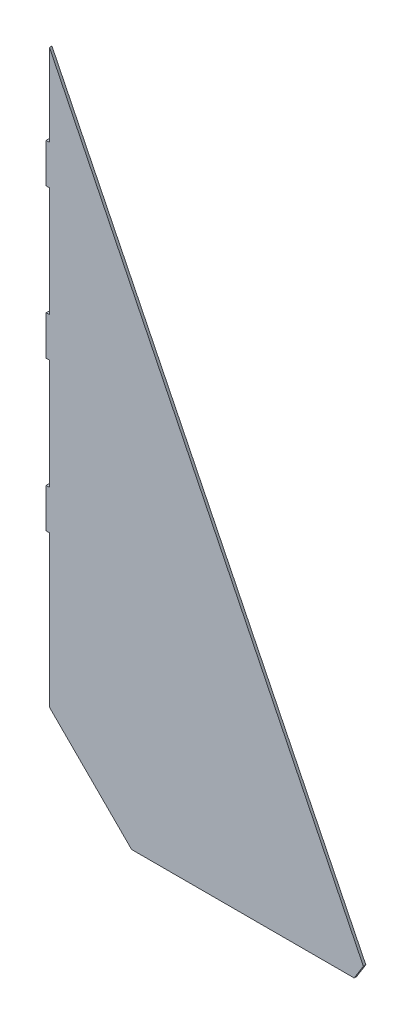
ISO-10303-21;
HEADER;
FILE_DESCRIPTION(('STEP AP214'),'2;1');
FILE_NAME('part.step','',(''),(''),'','','');
FILE_SCHEMA(('AUTOMOTIVE_DESIGN { 1 0 10303 214 1 1 1 1 }'));
ENDSEC;
DATA;
#1=APPLICATION_CONTEXT('core data for automotive mechanical design processes');
#2=APPLICATION_PROTOCOL_DEFINITION('international standard','automotive_design',2000,#1);
#3=PRODUCT_CONTEXT('',#1,'mechanical');
#4=PRODUCT('Part','Part','',(#3));
#5=PRODUCT_RELATED_PRODUCT_CATEGORY('part','',(#4));
#6=PRODUCT_DEFINITION_FORMATION('','',#4);
#7=PRODUCT_DEFINITION_CONTEXT('part definition',#1,'design');
#8=PRODUCT_DEFINITION('design','',#6,#7);
#9=PRODUCT_DEFINITION_SHAPE('','',#8);
#10=(LENGTH_UNIT() NAMED_UNIT(*) SI_UNIT(.MILLI.,.METRE.));
#11=(NAMED_UNIT(*) PLANE_ANGLE_UNIT() SI_UNIT($,.RADIAN.));
#12=(NAMED_UNIT(*) SI_UNIT($,.STERADIAN.) SOLID_ANGLE_UNIT());
#13=UNCERTAINTY_MEASURE_WITH_UNIT(LENGTH_MEASURE(1.E-05),#10,'distance_accuracy_value','');
#14=(GEOMETRIC_REPRESENTATION_CONTEXT(3) GLOBAL_UNCERTAINTY_ASSIGNED_CONTEXT((#13)) GLOBAL_UNIT_ASSIGNED_CONTEXT((#10,
#11,#12)) REPRESENTATION_CONTEXT('',''));
#15=CARTESIAN_POINT('',(0.,0.,0.));
#16=DIRECTION('',(0.,0.,1.));
#17=DIRECTION('',(1.,0.,0.));
#18=AXIS2_PLACEMENT_3D('',#15,#16,#17);
#19=CARTESIAN_POINT('',(0.,0.,1.5));
#20=DIRECTION('',(1.,0.,0.));
#21=DIRECTION('',(0.,0.,-1.));
#22=AXIS2_PLACEMENT_3D('',#19,#20,#21);
#23=PLANE('',#22);
#24=DIRECTION('',(0.,0.,1.));
#25=VECTOR('',#24,1.);
#26=CARTESIAN_POINT('',(0.,41.9833520752449,0.));
#27=LINE('',#26,#25);
#28=CARTESIAN_POINT('',(0.,41.9833520752449,0.));
#29=VERTEX_POINT('',#28);
#30=CARTESIAN_POINT('',(0.,41.9833520752449,1.5));
#31=VERTEX_POINT('',#30);
#32=EDGE_CURVE('E303',#29,#31,#27,.T.);
#33=ORIENTED_EDGE('',*,*,#32,.F.);
#34=DIRECTION('',(0.,-1.,0.));
#35=VECTOR('',#34,1.);
#36=CARTESIAN_POINT('',(0.,0.,0.));
#37=LINE('',#36,#35);
#38=CARTESIAN_POINT('',(0.,-50.,0.));
#39=VERTEX_POINT('',#38);
#40=EDGE_CURVE('E179',#29,#39,#37,.T.);
#41=ORIENTED_EDGE('',*,*,#40,.T.);
#42=DIRECTION('',(0.,0.,-1.));
#43=VECTOR('',#42,1.);
#44=CARTESIAN_POINT('',(0.,-50.,1.5));
#45=LINE('',#44,#43);
#46=CARTESIAN_POINT('',(0.,-50.,1.5));
#47=VERTEX_POINT('',#46);
#48=EDGE_CURVE('E11',#47,#39,#45,.T.);
#49=ORIENTED_EDGE('',*,*,#48,.F.);
#50=DIRECTION('',(0.,-1.,0.));
#51=VECTOR('',#50,1.);
#52=CARTESIAN_POINT('',(0.,-50.,1.5));
#53=LINE('',#52,#51);
#54=EDGE_CURVE('E39',#31,#47,#53,.T.);
#55=ORIENTED_EDGE('',*,*,#54,.F.);
#56=EDGE_LOOP('',(#33,#41,#49,#55));
#57=FACE_BOUND('',#56,.T.);
#58=ADVANCED_FACE('F35',(#57),#23,.F.);
#59=DIRECTION('',(0.,0.,-1.));
#60=VECTOR('',#59,1.);
#61=CARTESIAN_POINT('',(0.,65.9833520752449,0.));
#62=LINE('',#61,#60);
#63=CARTESIAN_POINT('',(0.,65.9833520752449,1.5));
#64=VERTEX_POINT('',#63);
#65=CARTESIAN_POINT('',(0.,65.9833520752449,0.));
#66=VERTEX_POINT('',#65);
#67=EDGE_CURVE('E60',#64,#66,#62,.T.);
#68=ORIENTED_EDGE('',*,*,#67,.F.);
#69=CARTESIAN_POINT('',(0.,132.983352075244,1.5));
#70=VERTEX_POINT('',#69);
#71=EDGE_CURVE('E259',#70,#64,#53,.T.);
#72=ORIENTED_EDGE('',*,*,#71,.F.);
#73=DIRECTION('',(0.,0.,1.));
#74=VECTOR('',#73,1.);
#75=CARTESIAN_POINT('',(0.,132.983352075244,0.));
#76=LINE('',#75,#74);
#77=CARTESIAN_POINT('',(0.,132.983352075244,0.));
#78=VERTEX_POINT('',#77);
#79=EDGE_CURVE('E180',#78,#70,#76,.T.);
#80=ORIENTED_EDGE('',*,*,#79,.F.);
#81=EDGE_CURVE('E255',#78,#66,#37,.T.);
#82=ORIENTED_EDGE('',*,*,#81,.T.);
#83=EDGE_LOOP('',(#68,#72,#80,#82));
#84=FACE_BOUND('',#83,.T.);
#85=ADVANCED_FACE('F333',(#84),#23,.F.);
#86=DIRECTION('',(0.,0.,-1.));
#87=VECTOR('',#86,1.);
#88=CARTESIAN_POINT('',(0.,156.983352075244,0.));
#89=LINE('',#88,#87);
#90=CARTESIAN_POINT('',(0.,156.983352075244,1.5));
#91=VERTEX_POINT('',#90);
#92=CARTESIAN_POINT('',(0.,156.983352075244,0.));
#93=VERTEX_POINT('',#92);
#94=EDGE_CURVE('E183',#91,#93,#89,.T.);
#95=ORIENTED_EDGE('',*,*,#94,.F.);
#96=CARTESIAN_POINT('',(0.,223.863160558031,1.5));
#97=VERTEX_POINT('',#96);
#98=EDGE_CURVE('E231',#97,#91,#53,.T.);
#99=ORIENTED_EDGE('',*,*,#98,.F.);
#100=DIRECTION('',(0.,0.,1.));
#101=VECTOR('',#100,1.);
#102=CARTESIAN_POINT('',(0.,223.863160558031,1.5));
#103=LINE('',#102,#101);
#104=CARTESIAN_POINT('',(0.,223.863160558031,0.));
#105=VERTEX_POINT('',#104);
#106=EDGE_CURVE('E212',#105,#97,#103,.T.);
#107=ORIENTED_EDGE('',*,*,#106,.F.);
#108=EDGE_CURVE('E258',#105,#93,#37,.T.);
#109=ORIENTED_EDGE('',*,*,#108,.T.);
#110=EDGE_LOOP('',(#95,#99,#107,#109));
#111=FACE_BOUND('',#110,.T.);
#112=ADVANCED_FACE('F347',(#111),#23,.F.);
#113=DIRECTION('',(0.,0.,-1.));
#114=VECTOR('',#113,1.);
#115=CARTESIAN_POINT('',(0.,247.863160558031,0.));
#116=LINE('',#115,#114);
#117=CARTESIAN_POINT('',(0.,247.863160558031,1.5));
#118=VERTEX_POINT('',#117);
#119=CARTESIAN_POINT('',(0.,247.863160558031,0.));
#120=VERTEX_POINT('',#119);
#121=EDGE_CURVE('E217',#118,#120,#116,.T.);
#122=ORIENTED_EDGE('',*,*,#121,.F.);
#123=CARTESIAN_POINT('',(0.,297.863160558031,1.5));
#124=VERTEX_POINT('',#123);
#125=EDGE_CURVE('E310',#124,#118,#53,.T.);
#126=ORIENTED_EDGE('',*,*,#125,.F.);
#127=DIRECTION('',(0.,0.,-1.));
#128=VECTOR('',#127,1.);
#129=CARTESIAN_POINT('',(0.,297.863160558031,1.5));
#130=LINE('',#129,#128);
#131=CARTESIAN_POINT('',(0.,297.863160558031,0.));
#132=VERTEX_POINT('',#131);
#133=EDGE_CURVE('E265',#124,#132,#130,.T.);
#134=ORIENTED_EDGE('',*,*,#133,.T.);
#135=EDGE_CURVE('E272',#132,#120,#37,.T.);
#136=ORIENTED_EDGE('',*,*,#135,.T.);
#137=EDGE_LOOP('',(#122,#126,#134,#136));
#138=FACE_BOUND('',#137,.T.);
#139=ADVANCED_FACE('F359',(#138),#23,.F.);
#140=CARTESIAN_POINT('',(50.,-100.,1.5));
#141=DIRECTION('',(0.707106781186547,0.707106781186548,0.));
#142=DIRECTION('',(-0.707106781186548,0.707106781186547,0.));
#143=AXIS2_PLACEMENT_3D('',#140,#141,#142);
#144=PLANE('',#143);
#145=DIRECTION('',(0.707106781186548,-0.707106781186547,0.));
#146=VECTOR('',#145,1.);
#147=CARTESIAN_POINT('',(50.,-100.,0.));
#148=LINE('',#147,#146);
#149=CARTESIAN_POINT('',(50.,-100.,0.));
#150=VERTEX_POINT('',#149);
#151=EDGE_CURVE('E242',#39,#150,#148,.T.);
#152=ORIENTED_EDGE('',*,*,#151,.T.);
#153=DIRECTION('',(0.,0.,-1.));
#154=VECTOR('',#153,1.);
#155=CARTESIAN_POINT('',(50.,-100.,1.5));
#156=LINE('',#155,#154);
#157=CARTESIAN_POINT('',(50.,-100.,1.5));
#158=VERTEX_POINT('',#157);
#159=EDGE_CURVE('E45',#158,#150,#156,.T.);
#160=ORIENTED_EDGE('',*,*,#159,.F.);
#161=DIRECTION('',(0.707106781186548,-0.707106781186547,0.));
#162=VECTOR('',#161,1.);
#163=CARTESIAN_POINT('',(50.,-100.,1.5));
#164=LINE('',#163,#162);
#165=EDGE_CURVE('E308',#47,#158,#164,.T.);
#166=ORIENTED_EDGE('',*,*,#165,.F.);
#167=ORIENTED_EDGE('',*,*,#48,.T.);
#168=EDGE_LOOP('',(#152,#160,#166,#167));
#169=FACE_BOUND('',#168,.T.);
#170=ADVANCED_FACE('F37',(#169),#144,.F.);
#171=CARTESIAN_POINT('',(185.503893900373,-99.9999999999999,1.5));
#172=DIRECTION('',(0.,1.,0.));
#173=DIRECTION('',(-1.,0.,0.));
#174=AXIS2_PLACEMENT_3D('',#171,#172,#173);
#175=PLANE('',#174);
#176=DIRECTION('',(1.,0.,0.));
#177=VECTOR('',#176,1.);
#178=CARTESIAN_POINT('',(185.503893900373,-99.9999999999999,0.));
#179=LINE('',#178,#177);
#180=CARTESIAN_POINT('',(185.503893900373,-99.9999999999999,0.));
#181=VERTEX_POINT('',#180);
#182=EDGE_CURVE('E299',#150,#181,#179,.T.);
#183=ORIENTED_EDGE('',*,*,#182,.T.);
#184=DIRECTION('',(0.,0.,-1.));
#185=VECTOR('',#184,1.);
#186=CARTESIAN_POINT('',(185.503893900373,-99.9999999999999,1.5));
#187=LINE('',#186,#185);
#188=CARTESIAN_POINT('',(185.503893900373,-99.9999999999999,1.5));
#189=VERTEX_POINT('',#188);
#190=EDGE_CURVE('E276',#189,#181,#187,.T.);
#191=ORIENTED_EDGE('',*,*,#190,.F.);
#192=DIRECTION('',(1.,0.,0.));
#193=VECTOR('',#192,1.);
#194=CARTESIAN_POINT('',(185.503893900373,-99.9999999999999,1.5));
#195=LINE('',#194,#193);
#196=EDGE_CURVE('E294',#158,#189,#195,.T.);
#197=ORIENTED_EDGE('',*,*,#196,.F.);
#198=ORIENTED_EDGE('',*,*,#159,.T.);
#199=EDGE_LOOP('',(#183,#191,#197,#198));
#200=FACE_BOUND('',#199,.T.);
#201=ADVANCED_FACE('F366',(#200),#175,.F.);
#202=CARTESIAN_POINT('',(191.09372222287,-91.0250133273105,1.5));
#203=DIRECTION('',(-0.848827770442937,0.528669477201846,0.));
#204=DIRECTION('',(-0.528669477201846,-0.848827770442937,0.));
#205=AXIS2_PLACEMENT_3D('',#202,#203,#204);
#206=PLANE('',#205);
#207=DIRECTION('',(0.528669477201846,0.848827770442937,0.));
#208=VECTOR('',#207,1.);
#209=CARTESIAN_POINT('',(191.09372222287,-91.0250133273105,0.));
#210=LINE('',#209,#208);
#211=CARTESIAN_POINT('',(191.09372222287,-91.0250133273105,0.));
#212=VERTEX_POINT('',#211);
#213=EDGE_CURVE('E300',#181,#212,#210,.T.);
#214=ORIENTED_EDGE('',*,*,#213,.T.);
#215=DIRECTION('',(0.,0.,-1.));
#216=VECTOR('',#215,1.);
#217=CARTESIAN_POINT('',(191.09372222287,-91.0250133273105,1.5));
#218=LINE('',#217,#216);
#219=CARTESIAN_POINT('',(191.09372222287,-91.0250133273105,1.5));
#220=VERTEX_POINT('',#219);
#221=EDGE_CURVE('E278',#220,#212,#218,.T.);
#222=ORIENTED_EDGE('',*,*,#221,.F.);
#223=DIRECTION('',(0.528669477201846,0.848827770442937,0.));
#224=VECTOR('',#223,1.);
#225=CARTESIAN_POINT('',(191.09372222287,-91.0250133273105,1.5));
#226=LINE('',#225,#224);
#227=EDGE_CURVE('E290',#189,#220,#226,.T.);
#228=ORIENTED_EDGE('',*,*,#227,.F.);
#229=ORIENTED_EDGE('',*,*,#190,.T.);
#230=EDGE_LOOP('',(#214,#222,#228,#229));
#231=FACE_BOUND('',#230,.T.);
#232=ADVANCED_FACE('F503',(#231),#206,.F.);
#233=CARTESIAN_POINT('',(0.,297.863160558031,1.5));
#234=DIRECTION('',(-0.897498667268944,-0.44101716775027,0.));
#235=DIRECTION('',(0.44101716775027,-0.897498667268944,0.));
#236=AXIS2_PLACEMENT_3D('',#233,#234,#235);
#237=PLANE('',#236);
#238=DIRECTION('',(-0.44101716775027,0.897498667268944,0.));
#239=VECTOR('',#238,1.);
#240=CARTESIAN_POINT('',(0.,297.863160558031,0.));
#241=LINE('',#240,#239);
#242=EDGE_CURVE('E263',#212,#132,#241,.T.);
#243=ORIENTED_EDGE('',*,*,#242,.T.);
#244=ORIENTED_EDGE('',*,*,#133,.F.);
#245=DIRECTION('',(-0.44101716775027,0.897498667268944,0.));
#246=VECTOR('',#245,1.);
#247=CARTESIAN_POINT('',(0.,297.863160558031,1.5));
#248=LINE('',#247,#246);
#249=EDGE_CURVE('E285',#220,#124,#248,.T.);
#250=ORIENTED_EDGE('',*,*,#249,.F.);
#251=ORIENTED_EDGE('',*,*,#221,.T.);
#252=EDGE_LOOP('',(#243,#244,#250,#251));
#253=FACE_BOUND('',#252,.T.);
#254=ADVANCED_FACE('F395',(#253),#237,.F.);
#255=CARTESIAN_POINT('',(0.,0.,1.5));
#256=DIRECTION('',(0.,0.,1.));
#257=DIRECTION('',(1.,0.,0.));
#258=AXIS2_PLACEMENT_3D('',#255,#256,#257);
#259=PLANE('',#258);
#260=ORIENTED_EDGE('',*,*,#125,.T.);
#261=DIRECTION('',(1.,0.,0.));
#262=VECTOR('',#261,1.);
#263=CARTESIAN_POINT('',(-2.,247.863160558031,1.5));
#264=LINE('',#263,#262);
#265=CARTESIAN_POINT('',(-2.,247.863160558031,1.5));
#266=VERTEX_POINT('',#265);
#267=EDGE_CURVE('E237',#266,#118,#264,.T.);
#268=ORIENTED_EDGE('',*,*,#267,.F.);
#269=DIRECTION('',(0.,1.,0.));
#270=VECTOR('',#269,1.);
#271=CARTESIAN_POINT('',(-2.,247.863160558031,1.5));
#272=LINE('',#271,#270);
#273=CARTESIAN_POINT('',(-2.,223.863160558031,1.5));
#274=VERTEX_POINT('',#273);
#275=EDGE_CURVE('E219',#274,#266,#272,.T.);
#276=ORIENTED_EDGE('',*,*,#275,.F.);
#277=DIRECTION('',(1.,0.,0.));
#278=VECTOR('',#277,1.);
#279=CARTESIAN_POINT('',(-2.,223.863160558031,1.5));
#280=LINE('',#279,#278);
#281=EDGE_CURVE('E233',#274,#97,#280,.T.);
#282=ORIENTED_EDGE('',*,*,#281,.T.);
#283=ORIENTED_EDGE('',*,*,#98,.T.);
#284=DIRECTION('',(1.,0.,0.));
#285=VECTOR('',#284,1.);
#286=CARTESIAN_POINT('',(-2.,156.983352075244,1.5));
#287=LINE('',#286,#285);
#288=CARTESIAN_POINT('',(-2.,156.983352075244,1.5));
#289=VERTEX_POINT('',#288);
#290=EDGE_CURVE('E203',#289,#91,#287,.T.);
#291=ORIENTED_EDGE('',*,*,#290,.F.);
#292=DIRECTION('',(0.,1.,0.));
#293=VECTOR('',#292,1.);
#294=CARTESIAN_POINT('',(-2.,156.983352075244,1.5));
#295=LINE('',#294,#293);
#296=CARTESIAN_POINT('',(-2.,132.983352075244,1.5));
#297=VERTEX_POINT('',#296);
#298=EDGE_CURVE('E194',#297,#289,#295,.T.);
#299=ORIENTED_EDGE('',*,*,#298,.F.);
#300=DIRECTION('',(1.,0.,0.));
#301=VECTOR('',#300,1.);
#302=CARTESIAN_POINT('',(-2.,132.983352075244,1.5));
#303=LINE('',#302,#301);
#304=EDGE_CURVE('E206',#297,#70,#303,.T.);
#305=ORIENTED_EDGE('',*,*,#304,.T.);
#306=ORIENTED_EDGE('',*,*,#71,.T.);
#307=DIRECTION('',(1.,0.,0.));
#308=VECTOR('',#307,1.);
#309=CARTESIAN_POINT('',(-2.,65.9833520752449,1.49999999999998));
#310=LINE('',#309,#308);
#311=CARTESIAN_POINT('',(-2.,65.9833520752449,1.49999999999998));
#312=VERTEX_POINT('',#311);
#313=EDGE_CURVE('E185',#312,#64,#310,.T.);
#314=ORIENTED_EDGE('',*,*,#313,.F.);
#315=DIRECTION('',(0.,1.,0.));
#316=VECTOR('',#315,1.);
#317=CARTESIAN_POINT('',(-2.,41.9833520752449,1.49999999999999));
#318=LINE('',#317,#316);
#319=CARTESIAN_POINT('',(-2.,41.9833520752449,1.49999999999999));
#320=VERTEX_POINT('',#319);
#321=EDGE_CURVE('E166',#320,#312,#318,.T.);
#322=ORIENTED_EDGE('',*,*,#321,.F.);
#323=DIRECTION('',(1.,0.,0.));
#324=VECTOR('',#323,1.);
#325=CARTESIAN_POINT('',(-2.,41.9833520752449,1.49999999999999));
#326=LINE('',#325,#324);
#327=EDGE_CURVE('E163',#320,#31,#326,.T.);
#328=ORIENTED_EDGE('',*,*,#327,.T.);
#329=ORIENTED_EDGE('',*,*,#54,.T.);
#330=ORIENTED_EDGE('',*,*,#165,.T.);
#331=ORIENTED_EDGE('',*,*,#196,.T.);
#332=ORIENTED_EDGE('',*,*,#227,.T.);
#333=ORIENTED_EDGE('',*,*,#249,.T.);
#334=EDGE_LOOP('',(#260,#268,#276,#282,#283,#291,#299,#305,#306,#314,#322,#328,#329,#330,#331,
#332,#333));
#335=FACE_BOUND('',#334,.T.);
#336=ADVANCED_FACE('F321',(#335),#259,.T.);
#337=CARTESIAN_POINT('',(0.,0.,0.));
#338=DIRECTION('',(0.,0.,1.));
#339=DIRECTION('',(1.,0.,0.));
#340=AXIS2_PLACEMENT_3D('',#337,#338,#339);
#341=PLANE('',#340);
#342=ORIENTED_EDGE('',*,*,#151,.F.);
#343=ORIENTED_EDGE('',*,*,#40,.F.);
#344=DIRECTION('',(1.,0.,0.));
#345=VECTOR('',#344,1.);
#346=CARTESIAN_POINT('',(-2.,41.9833520752449,0.));
#347=LINE('',#346,#345);
#348=CARTESIAN_POINT('',(-2.,41.9833520752449,0.));
#349=VERTEX_POINT('',#348);
#350=EDGE_CURVE('E161',#349,#29,#347,.T.);
#351=ORIENTED_EDGE('',*,*,#350,.F.);
#352=DIRECTION('',(0.,-1.,0.));
#353=VECTOR('',#352,1.);
#354=CARTESIAN_POINT('',(-2.,41.9833520752449,0.));
#355=LINE('',#354,#353);
#356=CARTESIAN_POINT('',(-2.,65.9833520752449,0.));
#357=VERTEX_POINT('',#356);
#358=EDGE_CURVE('E167',#357,#349,#355,.T.);
#359=ORIENTED_EDGE('',*,*,#358,.F.);
#360=DIRECTION('',(1.,0.,0.));
#361=VECTOR('',#360,1.);
#362=CARTESIAN_POINT('',(-2.,65.9833520752449,0.));
#363=LINE('',#362,#361);
#364=EDGE_CURVE('E323',#357,#66,#363,.T.);
#365=ORIENTED_EDGE('',*,*,#364,.T.);
#366=ORIENTED_EDGE('',*,*,#81,.F.);
#367=DIRECTION('',(1.,0.,0.));
#368=VECTOR('',#367,1.);
#369=CARTESIAN_POINT('',(-2.,132.983352075244,0.));
#370=LINE('',#369,#368);
#371=CARTESIAN_POINT('',(-2.,132.983352075244,0.));
#372=VERTEX_POINT('',#371);
#373=EDGE_CURVE('E209',#372,#78,#370,.T.);
#374=ORIENTED_EDGE('',*,*,#373,.F.);
#375=DIRECTION('',(0.,-1.,0.));
#376=VECTOR('',#375,1.);
#377=CARTESIAN_POINT('',(-2.,156.983352075244,0.));
#378=LINE('',#377,#376);
#379=CARTESIAN_POINT('',(-2.,156.983352075244,0.));
#380=VERTEX_POINT('',#379);
#381=EDGE_CURVE('E189',#380,#372,#378,.T.);
#382=ORIENTED_EDGE('',*,*,#381,.F.);
#383=DIRECTION('',(1.,0.,0.));
#384=VECTOR('',#383,1.);
#385=CARTESIAN_POINT('',(-2.,156.983352075244,0.));
#386=LINE('',#385,#384);
#387=EDGE_CURVE('E197',#380,#93,#386,.T.);
#388=ORIENTED_EDGE('',*,*,#387,.T.);
#389=ORIENTED_EDGE('',*,*,#108,.F.);
#390=DIRECTION('',(1.,0.,0.));
#391=VECTOR('',#390,1.);
#392=CARTESIAN_POINT('',(-2.,223.863160558031,0.));
#393=LINE('',#392,#391);
#394=CARTESIAN_POINT('',(-2.,223.863160558031,0.));
#395=VERTEX_POINT('',#394);
#396=EDGE_CURVE('E236',#395,#105,#393,.T.);
#397=ORIENTED_EDGE('',*,*,#396,.F.);
#398=DIRECTION('',(0.,-1.,0.));
#399=VECTOR('',#398,1.);
#400=CARTESIAN_POINT('',(-2.,223.863160558031,0.));
#401=LINE('',#400,#399);
#402=CARTESIAN_POINT('',(-2.,247.863160558031,0.));
#403=VERTEX_POINT('',#402);
#404=EDGE_CURVE('E213',#403,#395,#401,.T.);
#405=ORIENTED_EDGE('',*,*,#404,.F.);
#406=DIRECTION('',(1.,0.,0.));
#407=VECTOR('',#406,1.);
#408=CARTESIAN_POINT('',(-2.,247.863160558031,0.));
#409=LINE('',#408,#407);
#410=EDGE_CURVE('E223',#403,#120,#409,.T.);
#411=ORIENTED_EDGE('',*,*,#410,.T.);
#412=ORIENTED_EDGE('',*,*,#135,.F.);
#413=ORIENTED_EDGE('',*,*,#242,.F.);
#414=ORIENTED_EDGE('',*,*,#213,.F.);
#415=ORIENTED_EDGE('',*,*,#182,.F.);
#416=EDGE_LOOP('',(#342,#343,#351,#359,#365,#366,#374,#382,#388,#389,#397,#405,#411,#412,#413,
#414,#415));
#417=FACE_BOUND('',#416,.T.);
#418=ADVANCED_FACE('F178',(#417),#341,.F.);
#419=CARTESIAN_POINT('',(-2.,223.863160558031,1.5));
#420=DIRECTION('',(0.,1.,0.));
#421=DIRECTION('',(0.,0.,1.));
#422=AXIS2_PLACEMENT_3D('',#419,#420,#421);
#423=PLANE('',#422);
#424=ORIENTED_EDGE('',*,*,#106,.T.);
#425=ORIENTED_EDGE('',*,*,#281,.F.);
#426=DIRECTION('',(0.,0.,1.));
#427=VECTOR('',#426,1.);
#428=CARTESIAN_POINT('',(-2.,223.863160558031,1.5));
#429=LINE('',#428,#427);
#430=EDGE_CURVE('E216',#395,#274,#429,.T.);
#431=ORIENTED_EDGE('',*,*,#430,.F.);
#432=ORIENTED_EDGE('',*,*,#396,.T.);
#433=EDGE_LOOP('',(#424,#425,#431,#432));
#434=FACE_BOUND('',#433,.T.);
#435=ADVANCED_FACE('F350',(#434),#423,.F.);
#436=CARTESIAN_POINT('',(-2.,247.863160558031,0.));
#437=DIRECTION('',(0.,-1.,0.));
#438=DIRECTION('',(0.,0.,-1.));
#439=AXIS2_PLACEMENT_3D('',#436,#437,#438);
#440=PLANE('',#439);
#441=ORIENTED_EDGE('',*,*,#121,.T.);
#442=ORIENTED_EDGE('',*,*,#410,.F.);
#443=DIRECTION('',(0.,0.,-1.));
#444=VECTOR('',#443,1.);
#445=CARTESIAN_POINT('',(-2.,247.863160558031,0.));
#446=LINE('',#445,#444);
#447=EDGE_CURVE('E221',#266,#403,#446,.T.);
#448=ORIENTED_EDGE('',*,*,#447,.F.);
#449=ORIENTED_EDGE('',*,*,#267,.T.);
#450=EDGE_LOOP('',(#441,#442,#448,#449));
#451=FACE_BOUND('',#450,.T.);
#452=ADVANCED_FACE('F358',(#451),#440,.F.);
#453=CARTESIAN_POINT('',(-2.,0.,0.));
#454=DIRECTION('',(1.,0.,0.));
#455=DIRECTION('',(0.,0.,-1.));
#456=AXIS2_PLACEMENT_3D('',#453,#454,#455);
#457=PLANE('',#456);
#458=ORIENTED_EDGE('',*,*,#404,.T.);
#459=ORIENTED_EDGE('',*,*,#430,.T.);
#460=ORIENTED_EDGE('',*,*,#275,.T.);
#461=ORIENTED_EDGE('',*,*,#447,.T.);
#462=EDGE_LOOP('',(#458,#459,#460,#461));
#463=FACE_BOUND('',#462,.T.);
#464=ADVANCED_FACE('F354',(#463),#457,.F.);
#465=CARTESIAN_POINT('',(-2.,132.983352075244,0.));
#466=DIRECTION('',(0.,1.,0.));
#467=DIRECTION('',(0.,0.,1.));
#468=AXIS2_PLACEMENT_3D('',#465,#466,#467);
#469=PLANE('',#468);
#470=ORIENTED_EDGE('',*,*,#79,.T.);
#471=ORIENTED_EDGE('',*,*,#304,.F.);
#472=DIRECTION('',(0.,0.,1.));
#473=VECTOR('',#472,1.);
#474=CARTESIAN_POINT('',(-2.,132.983352075244,0.));
#475=LINE('',#474,#473);
#476=EDGE_CURVE('E192',#372,#297,#475,.T.);
#477=ORIENTED_EDGE('',*,*,#476,.F.);
#478=ORIENTED_EDGE('',*,*,#373,.T.);
#479=EDGE_LOOP('',(#470,#471,#477,#478));
#480=FACE_BOUND('',#479,.T.);
#481=ADVANCED_FACE('F336',(#480),#469,.F.);
#482=CARTESIAN_POINT('',(-2.,156.983352075244,0.));
#483=DIRECTION('',(0.,-1.,0.));
#484=DIRECTION('',(0.,0.,-1.));
#485=AXIS2_PLACEMENT_3D('',#482,#483,#484);
#486=PLANE('',#485);
#487=ORIENTED_EDGE('',*,*,#94,.T.);
#488=ORIENTED_EDGE('',*,*,#387,.F.);
#489=DIRECTION('',(0.,0.,-1.));
#490=VECTOR('',#489,1.);
#491=CARTESIAN_POINT('',(-2.,156.983352075244,0.));
#492=LINE('',#491,#490);
#493=EDGE_CURVE('E196',#289,#380,#492,.T.);
#494=ORIENTED_EDGE('',*,*,#493,.F.);
#495=ORIENTED_EDGE('',*,*,#290,.T.);
#496=EDGE_LOOP('',(#487,#488,#494,#495));
#497=FACE_BOUND('',#496,.T.);
#498=ADVANCED_FACE('F345',(#497),#486,.F.);
#499=CARTESIAN_POINT('',(-2.,0.,0.));
#500=DIRECTION('',(-1.,0.,0.));
#501=DIRECTION('',(0.,0.,1.));
#502=AXIS2_PLACEMENT_3D('',#499,#500,#501);
#503=PLANE('',#502);
#504=ORIENTED_EDGE('',*,*,#381,.T.);
#505=ORIENTED_EDGE('',*,*,#476,.T.);
#506=ORIENTED_EDGE('',*,*,#298,.T.);
#507=ORIENTED_EDGE('',*,*,#493,.T.);
#508=EDGE_LOOP('',(#504,#505,#506,#507));
#509=FACE_BOUND('',#508,.T.);
#510=ADVANCED_FACE('F339',(#509),#503,.T.);
#511=CARTESIAN_POINT('',(-2.,41.9833520752449,0.));
#512=DIRECTION('',(0.,1.,0.));
#513=DIRECTION('',(0.,0.,1.));
#514=AXIS2_PLACEMENT_3D('',#511,#512,#513);
#515=PLANE('',#514);
#516=ORIENTED_EDGE('',*,*,#32,.T.);
#517=ORIENTED_EDGE('',*,*,#327,.F.);
#518=DIRECTION('',(0.,0.,1.));
#519=VECTOR('',#518,1.);
#520=CARTESIAN_POINT('',(-2.,41.9833520752449,0.));
#521=LINE('',#520,#519);
#522=EDGE_CURVE('E157',#349,#320,#521,.T.);
#523=ORIENTED_EDGE('',*,*,#522,.F.);
#524=ORIENTED_EDGE('',*,*,#350,.T.);
#525=EDGE_LOOP('',(#516,#517,#523,#524));
#526=FACE_BOUND('',#525,.T.);
#527=ADVANCED_FACE('F159',(#526),#515,.F.);
#528=CARTESIAN_POINT('',(-2.,65.9833520752449,0.));
#529=DIRECTION('',(0.,-1.,0.));
#530=DIRECTION('',(0.,0.,-1.));
#531=AXIS2_PLACEMENT_3D('',#528,#529,#530);
#532=PLANE('',#531);
#533=ORIENTED_EDGE('',*,*,#67,.T.);
#534=ORIENTED_EDGE('',*,*,#364,.F.);
#535=DIRECTION('',(0.,0.,-1.));
#536=VECTOR('',#535,1.);
#537=CARTESIAN_POINT('',(-2.,65.9833520752449,0.));
#538=LINE('',#537,#536);
#539=EDGE_CURVE('E172',#312,#357,#538,.T.);
#540=ORIENTED_EDGE('',*,*,#539,.F.);
#541=ORIENTED_EDGE('',*,*,#313,.T.);
#542=EDGE_LOOP('',(#533,#534,#540,#541));
#543=FACE_BOUND('',#542,.T.);
#544=ADVANCED_FACE('F329',(#543),#532,.F.);
#545=CARTESIAN_POINT('',(-2.,0.,0.));
#546=DIRECTION('',(1.,0.,0.));
#547=DIRECTION('',(0.,0.,-1.));
#548=AXIS2_PLACEMENT_3D('',#545,#546,#547);
#549=PLANE('',#548);
#550=ORIENTED_EDGE('',*,*,#358,.T.);
#551=ORIENTED_EDGE('',*,*,#522,.T.);
#552=ORIENTED_EDGE('',*,*,#321,.T.);
#553=ORIENTED_EDGE('',*,*,#539,.T.);
#554=EDGE_LOOP('',(#550,#551,#552,#553));
#555=FACE_BOUND('',#554,.T.);
#556=ADVANCED_FACE('F170',(#555),#549,.F.);
#557=CLOSED_SHELL('',(#58,#85,#112,#139,#170,#201,#232,#254,#336,#418,#435,#452,#464,#481,#498,
#510,#527,#544,#556));
#558=MANIFOLD_SOLID_BREP('B2',#557);
#559=ADVANCED_BREP_SHAPE_REPRESENTATION('',(#18,#558),#14);
#560=SHAPE_DEFINITION_REPRESENTATION(#9,#559);
ENDSEC;
END-ISO-10303-21;
